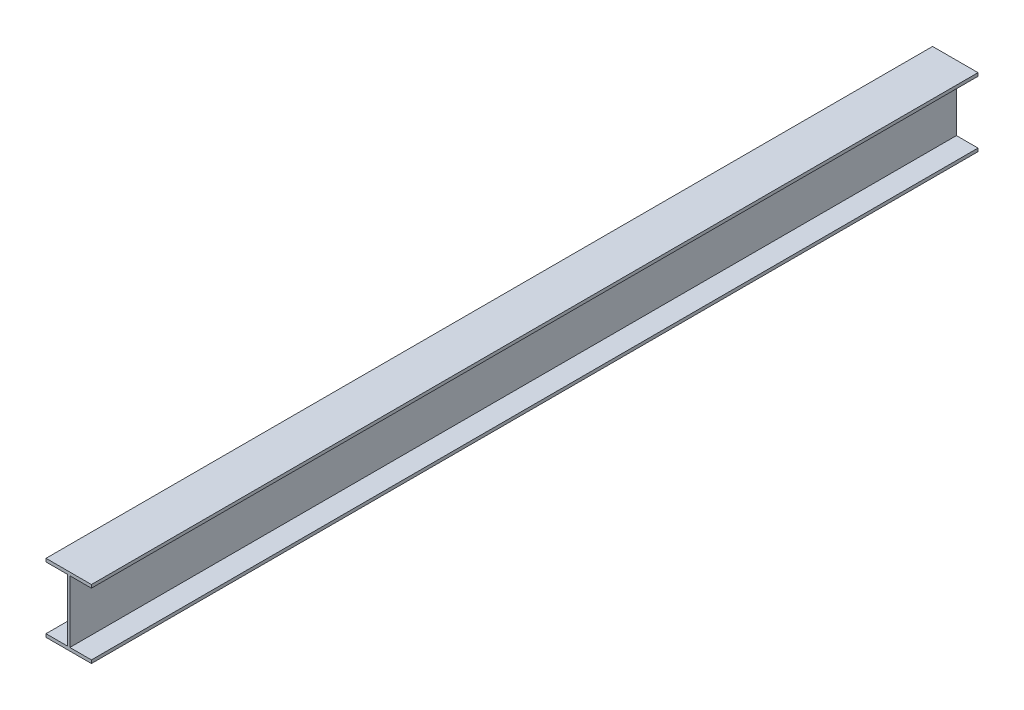
ISO-10303-21;
HEADER;
FILE_DESCRIPTION(('STEP AP214'),'2;1');
FILE_NAME('part.step','',(''),(''),'','','');
FILE_SCHEMA(('AUTOMOTIVE_DESIGN { 1 0 10303 214 1 1 1 1 }'));
ENDSEC;
DATA;
#1=APPLICATION_CONTEXT('core data for automotive mechanical design processes');
#2=APPLICATION_PROTOCOL_DEFINITION('international standard','automotive_design',2000,#1);
#3=PRODUCT_CONTEXT('',#1,'mechanical');
#4=PRODUCT('Part','Part','',(#3));
#5=PRODUCT_RELATED_PRODUCT_CATEGORY('part','',(#4));
#6=PRODUCT_DEFINITION_FORMATION('','',#4);
#7=PRODUCT_DEFINITION_CONTEXT('part definition',#1,'design');
#8=PRODUCT_DEFINITION('design','',#6,#7);
#9=PRODUCT_DEFINITION_SHAPE('','',#8);
#10=(LENGTH_UNIT() NAMED_UNIT(*) SI_UNIT(.MILLI.,.METRE.));
#11=(NAMED_UNIT(*) PLANE_ANGLE_UNIT() SI_UNIT($,.RADIAN.));
#12=(NAMED_UNIT(*) SI_UNIT($,.STERADIAN.) SOLID_ANGLE_UNIT());
#13=UNCERTAINTY_MEASURE_WITH_UNIT(LENGTH_MEASURE(1.E-05),#10,'distance_accuracy_value','');
#14=(GEOMETRIC_REPRESENTATION_CONTEXT(3) GLOBAL_UNCERTAINTY_ASSIGNED_CONTEXT((#13)) GLOBAL_UNIT_ASSIGNED_CONTEXT((#10,
#11,#12)) REPRESENTATION_CONTEXT('',''));
#15=CARTESIAN_POINT('',(0.,0.,0.));
#16=DIRECTION('',(0.,0.,1.));
#17=DIRECTION('',(1.,0.,0.));
#18=AXIS2_PLACEMENT_3D('',#15,#16,#17);
#19=CARTESIAN_POINT('',(101.6,-153.162240532958,1800.));
#20=DIRECTION('',(0.,1.,0.));
#21=DIRECTION('',(0.,0.,1.));
#22=AXIS2_PLACEMENT_3D('',#19,#20,#21);
#23=PLANE('',#22);
#24=DIRECTION('',(-1.,0.,0.));
#25=VECTOR('',#24,1.);
#26=CARTESIAN_POINT('',(101.6,-153.162240532958,1050.));
#27=LINE('',#26,#25);
#28=CARTESIAN_POINT('',(101.6,-153.162240532958,1050.));
#29=VERTEX_POINT('',#28);
#30=CARTESIAN_POINT('',(0.,-153.162240532958,1050.));
#31=VERTEX_POINT('',#30);
#32=EDGE_CURVE('E11',#29,#31,#27,.T.);
#33=ORIENTED_EDGE('',*,*,#32,.F.);
#34=DIRECTION('',(0.,0.,-1.));
#35=VECTOR('',#34,1.);
#36=CARTESIAN_POINT('',(101.6,-153.162240532958,1800.));
#37=LINE('',#36,#35);
#38=CARTESIAN_POINT('',(101.6,-153.162240532958,1800.));
#39=VERTEX_POINT('',#38);
#40=EDGE_CURVE('E232',#39,#29,#37,.T.);
#41=ORIENTED_EDGE('',*,*,#40,.F.);
#42=DIRECTION('',(1.,0.,0.));
#43=VECTOR('',#42,1.);
#44=CARTESIAN_POINT('',(101.6,-153.162240532958,1800.));
#45=LINE('',#44,#43);
#46=CARTESIAN_POINT('',(0.,-153.162240532958,1800.));
#47=VERTEX_POINT('',#46);
#48=EDGE_CURVE('E206',#47,#39,#45,.T.);
#49=ORIENTED_EDGE('',*,*,#48,.F.);
#50=DIRECTION('',(0.,0.,-1.));
#51=VECTOR('',#50,1.);
#52=CARTESIAN_POINT('',(0.,-153.162240532958,1800.));
#53=LINE('',#52,#51);
#54=EDGE_CURVE('E237',#47,#31,#53,.T.);
#55=ORIENTED_EDGE('',*,*,#54,.T.);
#56=EDGE_LOOP('',(#33,#41,#49,#55));
#57=FACE_BOUND('',#56,.T.);
#58=ADVANCED_FACE('F37',(#57),#23,.F.);
#59=DIRECTION('',(1.,0.,0.));
#60=VECTOR('',#59,1.);
#61=CARTESIAN_POINT('',(101.6,-153.162240532958,750.));
#62=LINE('',#61,#60);
#63=CARTESIAN_POINT('',(0.,-153.162240532958,750.));
#64=VERTEX_POINT('',#63);
#65=CARTESIAN_POINT('',(101.6,-153.162240532958,750.));
#66=VERTEX_POINT('',#65);
#67=EDGE_CURVE('E46',#64,#66,#62,.T.);
#68=ORIENTED_EDGE('',*,*,#67,.F.);
#69=CARTESIAN_POINT('',(0.,-153.162240532958,-183.1));
#70=VERTEX_POINT('',#69);
#71=EDGE_CURVE('E235',#64,#70,#53,.T.);
#72=ORIENTED_EDGE('',*,*,#71,.T.);
#73=DIRECTION('',(-1.,0.,0.));
#74=VECTOR('',#73,1.);
#75=CARTESIAN_POINT('',(101.6,-153.162240532958,-183.1));
#76=LINE('',#75,#74);
#77=CARTESIAN_POINT('',(101.6,-153.162240532958,-183.1));
#78=VERTEX_POINT('',#77);
#79=EDGE_CURVE('E188',#78,#70,#76,.T.);
#80=ORIENTED_EDGE('',*,*,#79,.F.);
#81=EDGE_CURVE('E231',#66,#78,#37,.T.);
#82=ORIENTED_EDGE('',*,*,#81,.F.);
#83=EDGE_LOOP('',(#68,#72,#80,#82));
#84=FACE_BOUND('',#83,.T.);
#85=ADVANCED_FACE('F255',(#84),#23,.F.);
#86=CARTESIAN_POINT('',(0.,-7.11224053295814,1800.));
#87=DIRECTION('',(1.,0.,0.));
#88=DIRECTION('',(0.,0.,-1.));
#89=AXIS2_PLACEMENT_3D('',#86,#87,#88);
#90=PLANE('',#89);
#91=DIRECTION('',(0.,0.,-1.));
#92=VECTOR('',#91,1.);
#93=CARTESIAN_POINT('',(0.,-0.000240532958142959,1800.));
#94=LINE('',#93,#92);
#95=CARTESIAN_POINT('',(0.,-0.000240532958142959,1800.));
#96=VERTEX_POINT('',#95);
#97=CARTESIAN_POINT('',(0.,-0.000240532958142959,-183.1));
#98=VERTEX_POINT('',#97);
#99=EDGE_CURVE('E159',#96,#98,#94,.T.);
#100=ORIENTED_EDGE('',*,*,#99,.T.);
#101=DIRECTION('',(0.,1.,0.));
#102=VECTOR('',#101,1.);
#103=CARTESIAN_POINT('',(0.,-7.11224053295814,-183.1));
#104=LINE('',#103,#102);
#105=CARTESIAN_POINT('',(0.,-7.11224053295814,-183.1));
#106=VERTEX_POINT('',#105);
#107=EDGE_CURVE('E157',#106,#98,#104,.T.);
#108=ORIENTED_EDGE('',*,*,#107,.F.);
#109=DIRECTION('',(0.,0.,-1.));
#110=VECTOR('',#109,1.);
#111=CARTESIAN_POINT('',(0.,-7.11224053295814,1800.));
#112=LINE('',#111,#110);
#113=CARTESIAN_POINT('',(0.,-7.11224053295814,1800.));
#114=VERTEX_POINT('',#113);
#115=EDGE_CURVE('E144',#114,#106,#112,.T.);
#116=ORIENTED_EDGE('',*,*,#115,.F.);
#117=DIRECTION('',(0.,-1.,0.));
#118=VECTOR('',#117,1.);
#119=CARTESIAN_POINT('',(0.,-7.11224053295814,1800.));
#120=LINE('',#119,#118);
#121=EDGE_CURVE('E197',#96,#114,#120,.T.);
#122=ORIENTED_EDGE('',*,*,#121,.F.);
#123=EDGE_LOOP('',(#100,#108,#116,#122));
#124=FACE_BOUND('',#123,.T.);
#125=ADVANCED_FACE('F39',(#124),#90,.F.);
#126=CARTESIAN_POINT('',(47.5660357142857,-7.11224053295814,1800.));
#127=DIRECTION('',(0.,1.,0.));
#128=DIRECTION('',(-1.,0.,0.));
#129=AXIS2_PLACEMENT_3D('',#126,#127,#128);
#130=PLANE('',#129);
#131=ORIENTED_EDGE('',*,*,#115,.T.);
#132=DIRECTION('',(-1.,0.,0.));
#133=VECTOR('',#132,1.);
#134=CARTESIAN_POINT('',(47.5660357142857,-7.11224053295814,-183.1));
#135=LINE('',#134,#133);
#136=CARTESIAN_POINT('',(47.5660357142857,-7.11224053295814,-183.1));
#137=VERTEX_POINT('',#136);
#138=EDGE_CURVE('E149',#137,#106,#135,.T.);
#139=ORIENTED_EDGE('',*,*,#138,.F.);
#140=DIRECTION('',(0.,0.,-1.));
#141=VECTOR('',#140,1.);
#142=CARTESIAN_POINT('',(47.5660357142857,-7.11224053295814,1800.));
#143=LINE('',#142,#141);
#144=CARTESIAN_POINT('',(47.5660357142857,-7.11224053295814,1800.));
#145=VERTEX_POINT('',#144);
#146=EDGE_CURVE('E154',#145,#137,#143,.T.);
#147=ORIENTED_EDGE('',*,*,#146,.F.);
#148=DIRECTION('',(1.,0.,0.));
#149=VECTOR('',#148,1.);
#150=CARTESIAN_POINT('',(47.5660357142857,-7.11224053295814,1800.));
#151=LINE('',#150,#149);
#152=EDGE_CURVE('E150',#114,#145,#151,.T.);
#153=ORIENTED_EDGE('',*,*,#152,.F.);
#154=EDGE_LOOP('',(#131,#139,#147,#153));
#155=FACE_BOUND('',#154,.T.);
#156=ADVANCED_FACE('F146',(#155),#130,.F.);
#157=CARTESIAN_POINT('',(47.5660357142857,-146.050240532958,1800.));
#158=DIRECTION('',(1.,0.,0.));
#159=DIRECTION('',(0.,0.,-1.));
#160=AXIS2_PLACEMENT_3D('',#157,#158,#159);
#161=PLANE('',#160);
#162=ORIENTED_EDGE('',*,*,#146,.T.);
#163=DIRECTION('',(0.,1.,0.));
#164=VECTOR('',#163,1.);
#165=CARTESIAN_POINT('',(47.5660357142857,-146.050240532958,-183.1));
#166=LINE('',#165,#164);
#167=CARTESIAN_POINT('',(47.5660357142857,-146.050240532958,-183.1));
#168=VERTEX_POINT('',#167);
#169=EDGE_CURVE('E169',#168,#137,#166,.T.);
#170=ORIENTED_EDGE('',*,*,#169,.F.);
#171=DIRECTION('',(0.,0.,-1.));
#172=VECTOR('',#171,1.);
#173=CARTESIAN_POINT('',(47.5660357142857,-146.050240532958,1800.));
#174=LINE('',#173,#172);
#175=CARTESIAN_POINT('',(47.5660357142857,-146.050240532958,1800.));
#176=VERTEX_POINT('',#175);
#177=EDGE_CURVE('E243',#176,#168,#174,.T.);
#178=ORIENTED_EDGE('',*,*,#177,.F.);
#179=DIRECTION('',(0.,-1.,0.));
#180=VECTOR('',#179,1.);
#181=CARTESIAN_POINT('',(47.5660357142857,-146.050240532958,1800.));
#182=LINE('',#181,#180);
#183=EDGE_CURVE('E200',#145,#176,#182,.T.);
#184=ORIENTED_EDGE('',*,*,#183,.F.);
#185=EDGE_LOOP('',(#162,#170,#178,#184));
#186=FACE_BOUND('',#185,.T.);
#187=ADVANCED_FACE('F278',(#186),#161,.F.);
#188=CARTESIAN_POINT('',(0.,-146.050240532958,1800.));
#189=DIRECTION('',(0.,-1.,0.));
#190=DIRECTION('',(1.,0.,0.));
#191=AXIS2_PLACEMENT_3D('',#188,#189,#190);
#192=PLANE('',#191);
#193=ORIENTED_EDGE('',*,*,#177,.T.);
#194=DIRECTION('',(1.,0.,0.));
#195=VECTOR('',#194,1.);
#196=CARTESIAN_POINT('',(0.,-146.050240532958,-183.1));
#197=LINE('',#196,#195);
#198=CARTESIAN_POINT('',(0.,-146.050240532958,-183.1));
#199=VERTEX_POINT('',#198);
#200=EDGE_CURVE('E194',#199,#168,#197,.T.);
#201=ORIENTED_EDGE('',*,*,#200,.F.);
#202=DIRECTION('',(0.,0.,-1.));
#203=VECTOR('',#202,1.);
#204=CARTESIAN_POINT('',(0.,-146.050240532958,1800.));
#205=LINE('',#204,#203);
#206=CARTESIAN_POINT('',(0.,-146.050240532958,1800.));
#207=VERTEX_POINT('',#206);
#208=EDGE_CURVE('E240',#207,#199,#205,.T.);
#209=ORIENTED_EDGE('',*,*,#208,.F.);
#210=DIRECTION('',(-1.,0.,0.));
#211=VECTOR('',#210,1.);
#212=CARTESIAN_POINT('',(0.,-146.050240532958,1800.));
#213=LINE('',#212,#211);
#214=EDGE_CURVE('E202',#176,#207,#213,.T.);
#215=ORIENTED_EDGE('',*,*,#214,.F.);
#216=EDGE_LOOP('',(#193,#201,#209,#215));
#217=FACE_BOUND('',#216,.T.);
#218=ADVANCED_FACE('F274',(#217),#192,.F.);
#219=CARTESIAN_POINT('',(0.,-153.162240532958,1800.));
#220=DIRECTION('',(1.,0.,0.));
#221=DIRECTION('',(0.,0.,-1.));
#222=AXIS2_PLACEMENT_3D('',#219,#220,#221);
#223=PLANE('',#222);
#224=ORIENTED_EDGE('',*,*,#208,.T.);
#225=DIRECTION('',(0.,1.,0.));
#226=VECTOR('',#225,1.);
#227=CARTESIAN_POINT('',(0.,-153.162240532958,-183.1));
#228=LINE('',#227,#226);
#229=EDGE_CURVE('E191',#70,#199,#228,.T.);
#230=ORIENTED_EDGE('',*,*,#229,.F.);
#231=ORIENTED_EDGE('',*,*,#71,.F.);
#232=CARTESIAN_POINT('',(0.,-153.162240532958,900.));
#233=VERTEX_POINT('',#232);
#234=EDGE_CURVE('E59',#233,#64,#53,.T.);
#235=ORIENTED_EDGE('',*,*,#234,.F.);
#236=EDGE_CURVE('E241',#31,#233,#53,.T.);
#237=ORIENTED_EDGE('',*,*,#236,.F.);
#238=ORIENTED_EDGE('',*,*,#54,.F.);
#239=DIRECTION('',(0.,-1.,0.));
#240=VECTOR('',#239,1.);
#241=CARTESIAN_POINT('',(0.,-153.162240532958,1800.));
#242=LINE('',#241,#240);
#243=EDGE_CURVE('E204',#207,#47,#242,.T.);
#244=ORIENTED_EDGE('',*,*,#243,.F.);
#245=EDGE_LOOP('',(#224,#230,#231,#235,#237,#238,#244));
#246=FACE_BOUND('',#245,.T.);
#247=ADVANCED_FACE('F263',(#246),#223,.F.);
#248=CARTESIAN_POINT('',(101.6,-153.162240532958,900.));
#249=VERTEX_POINT('',#248);
#250=EDGE_CURVE('E236',#29,#249,#37,.T.);
#251=ORIENTED_EDGE('',*,*,#250,.F.);
#252=ORIENTED_EDGE('',*,*,#32,.T.);
#253=ORIENTED_EDGE('',*,*,#236,.T.);
#254=ORIENTED_EDGE('',*,*,#234,.T.);
#255=ORIENTED_EDGE('',*,*,#67,.T.);
#256=EDGE_CURVE('E252',#249,#66,#37,.T.);
#257=ORIENTED_EDGE('',*,*,#256,.F.);
#258=EDGE_LOOP('',(#251,#252,#253,#254,#255,#257));
#259=FACE_BOUND('',#258,.T.);
#260=ADVANCED_FACE('F250',(#259),#23,.F.);
#261=CARTESIAN_POINT('',(101.6,-146.050240532958,1800.));
#262=DIRECTION('',(-1.,0.,0.));
#263=DIRECTION('',(0.,0.,1.));
#264=AXIS2_PLACEMENT_3D('',#261,#262,#263);
#265=PLANE('',#264);
#266=ORIENTED_EDGE('',*,*,#81,.T.);
#267=DIRECTION('',(0.,-1.,0.));
#268=VECTOR('',#267,1.);
#269=CARTESIAN_POINT('',(101.6,-146.050240532958,-183.1));
#270=LINE('',#269,#268);
#271=CARTESIAN_POINT('',(101.6,-146.050240532958,-183.1));
#272=VERTEX_POINT('',#271);
#273=EDGE_CURVE('E185',#272,#78,#270,.T.);
#274=ORIENTED_EDGE('',*,*,#273,.F.);
#275=DIRECTION('',(0.,0.,-1.));
#276=VECTOR('',#275,1.);
#277=CARTESIAN_POINT('',(101.6,-146.050240532958,1800.));
#278=LINE('',#277,#276);
#279=CARTESIAN_POINT('',(101.6,-146.050240532958,1800.));
#280=VERTEX_POINT('',#279);
#281=EDGE_CURVE('E229',#280,#272,#278,.T.);
#282=ORIENTED_EDGE('',*,*,#281,.F.);
#283=DIRECTION('',(0.,1.,0.));
#284=VECTOR('',#283,1.);
#285=CARTESIAN_POINT('',(101.6,-146.050240532958,1800.));
#286=LINE('',#285,#284);
#287=EDGE_CURVE('E208',#39,#280,#286,.T.);
#288=ORIENTED_EDGE('',*,*,#287,.F.);
#289=ORIENTED_EDGE('',*,*,#40,.T.);
#290=ORIENTED_EDGE('',*,*,#250,.T.);
#291=ORIENTED_EDGE('',*,*,#256,.T.);
#292=EDGE_LOOP('',(#266,#274,#282,#288,#289,#290,#291));
#293=FACE_BOUND('',#292,.T.);
#294=ADVANCED_FACE('F258',(#293),#265,.F.);
#295=CARTESIAN_POINT('',(53.4080357142857,-146.050240532958,1800.));
#296=DIRECTION('',(0.,-1.,0.));
#297=DIRECTION('',(1.,0.,0.));
#298=AXIS2_PLACEMENT_3D('',#295,#296,#297);
#299=PLANE('',#298);
#300=ORIENTED_EDGE('',*,*,#281,.T.);
#301=DIRECTION('',(1.,0.,0.));
#302=VECTOR('',#301,1.);
#303=CARTESIAN_POINT('',(53.4080357142857,-146.050240532958,-183.1));
#304=LINE('',#303,#302);
#305=CARTESIAN_POINT('',(53.4080357142857,-146.050240532958,-183.1));
#306=VERTEX_POINT('',#305);
#307=EDGE_CURVE('E182',#306,#272,#304,.T.);
#308=ORIENTED_EDGE('',*,*,#307,.F.);
#309=DIRECTION('',(0.,0.,-1.));
#310=VECTOR('',#309,1.);
#311=CARTESIAN_POINT('',(53.4080357142857,-146.050240532958,1800.));
#312=LINE('',#311,#310);
#313=CARTESIAN_POINT('',(53.4080357142857,-146.050240532958,1800.));
#314=VERTEX_POINT('',#313);
#315=EDGE_CURVE('E227',#314,#306,#312,.T.);
#316=ORIENTED_EDGE('',*,*,#315,.F.);
#317=DIRECTION('',(-1.,0.,0.));
#318=VECTOR('',#317,1.);
#319=CARTESIAN_POINT('',(53.4080357142857,-146.050240532958,1800.));
#320=LINE('',#319,#318);
#321=EDGE_CURVE('E210',#280,#314,#320,.T.);
#322=ORIENTED_EDGE('',*,*,#321,.F.);
#323=EDGE_LOOP('',(#300,#308,#316,#322));
#324=FACE_BOUND('',#323,.T.);
#325=ADVANCED_FACE('F301',(#324),#299,.F.);
#326=CARTESIAN_POINT('',(53.4080357142857,-7.11224053295815,1800.));
#327=DIRECTION('',(-1.,0.,0.));
#328=DIRECTION('',(0.,-1.,0.));
#329=AXIS2_PLACEMENT_3D('',#326,#327,#328);
#330=PLANE('',#329);
#331=ORIENTED_EDGE('',*,*,#315,.T.);
#332=DIRECTION('',(0.,-1.,0.));
#333=VECTOR('',#332,1.);
#334=CARTESIAN_POINT('',(53.4080357142857,-7.11224053295815,-183.1));
#335=LINE('',#334,#333);
#336=CARTESIAN_POINT('',(53.4080357142857,-7.11224053295815,-183.1));
#337=VERTEX_POINT('',#336);
#338=EDGE_CURVE('E179',#337,#306,#335,.T.);
#339=ORIENTED_EDGE('',*,*,#338,.F.);
#340=DIRECTION('',(0.,0.,-1.));
#341=VECTOR('',#340,1.);
#342=CARTESIAN_POINT('',(53.4080357142857,-7.11224053295815,1800.));
#343=LINE('',#342,#341);
#344=CARTESIAN_POINT('',(53.4080357142857,-7.11224053295815,1800.));
#345=VERTEX_POINT('',#344);
#346=EDGE_CURVE('E225',#345,#337,#343,.T.);
#347=ORIENTED_EDGE('',*,*,#346,.F.);
#348=DIRECTION('',(0.,1.,0.));
#349=VECTOR('',#348,1.);
#350=CARTESIAN_POINT('',(53.4080357142857,-7.11224053295815,1800.));
#351=LINE('',#350,#349);
#352=EDGE_CURVE('E212',#314,#345,#351,.T.);
#353=ORIENTED_EDGE('',*,*,#352,.F.);
#354=EDGE_LOOP('',(#331,#339,#347,#353));
#355=FACE_BOUND('',#354,.T.);
#356=ADVANCED_FACE('F296',(#355),#330,.F.);
#357=CARTESIAN_POINT('',(101.6,-7.11224053295814,1800.));
#358=DIRECTION('',(0.,1.,0.));
#359=DIRECTION('',(-1.,0.,0.));
#360=AXIS2_PLACEMENT_3D('',#357,#358,#359);
#361=PLANE('',#360);
#362=ORIENTED_EDGE('',*,*,#346,.T.);
#363=DIRECTION('',(-1.,0.,0.));
#364=VECTOR('',#363,1.);
#365=CARTESIAN_POINT('',(101.6,-7.11224053295814,-183.1));
#366=LINE('',#365,#364);
#367=CARTESIAN_POINT('',(101.6,-7.11224053295814,-183.1));
#368=VERTEX_POINT('',#367);
#369=EDGE_CURVE('E176',#368,#337,#366,.T.);
#370=ORIENTED_EDGE('',*,*,#369,.F.);
#371=DIRECTION('',(0.,0.,-1.));
#372=VECTOR('',#371,1.);
#373=CARTESIAN_POINT('',(101.6,-7.11224053295814,1800.));
#374=LINE('',#373,#372);
#375=CARTESIAN_POINT('',(101.6,-7.11224053295814,1800.));
#376=VERTEX_POINT('',#375);
#377=EDGE_CURVE('E223',#376,#368,#374,.T.);
#378=ORIENTED_EDGE('',*,*,#377,.F.);
#379=DIRECTION('',(1.,0.,0.));
#380=VECTOR('',#379,1.);
#381=CARTESIAN_POINT('',(101.6,-7.11224053295814,1800.));
#382=LINE('',#381,#380);
#383=EDGE_CURVE('E214',#345,#376,#382,.T.);
#384=ORIENTED_EDGE('',*,*,#383,.F.);
#385=EDGE_LOOP('',(#362,#370,#378,#384));
#386=FACE_BOUND('',#385,.T.);
#387=ADVANCED_FACE('F291',(#386),#361,.F.);
#388=CARTESIAN_POINT('',(101.6,-0.000240532958130516,1800.));
#389=DIRECTION('',(-1.,0.,0.));
#390=DIRECTION('',(0.,0.,1.));
#391=AXIS2_PLACEMENT_3D('',#388,#389,#390);
#392=PLANE('',#391);
#393=ORIENTED_EDGE('',*,*,#377,.T.);
#394=DIRECTION('',(0.,-1.,0.));
#395=VECTOR('',#394,1.);
#396=CARTESIAN_POINT('',(101.6,-0.000240532958130516,-183.1));
#397=LINE('',#396,#395);
#398=CARTESIAN_POINT('',(101.6,-0.000240532958130516,-183.1));
#399=VERTEX_POINT('',#398);
#400=EDGE_CURVE('E173',#399,#368,#397,.T.);
#401=ORIENTED_EDGE('',*,*,#400,.F.);
#402=DIRECTION('',(0.,0.,-1.));
#403=VECTOR('',#402,1.);
#404=CARTESIAN_POINT('',(101.6,-0.000240532958130516,1800.));
#405=LINE('',#404,#403);
#406=CARTESIAN_POINT('',(101.6,-0.000240532958130516,1800.));
#407=VERTEX_POINT('',#406);
#408=EDGE_CURVE('E221',#407,#399,#405,.T.);
#409=ORIENTED_EDGE('',*,*,#408,.F.);
#410=DIRECTION('',(0.,1.,0.));
#411=VECTOR('',#410,1.);
#412=CARTESIAN_POINT('',(101.6,-0.000240532958130516,1800.));
#413=LINE('',#412,#411);
#414=EDGE_CURVE('E216',#376,#407,#413,.T.);
#415=ORIENTED_EDGE('',*,*,#414,.F.);
#416=EDGE_LOOP('',(#393,#401,#409,#415));
#417=FACE_BOUND('',#416,.T.);
#418=ADVANCED_FACE('F287',(#417),#392,.F.);
#419=CARTESIAN_POINT('',(0.,-0.000240532958142959,1800.));
#420=DIRECTION('',(0.,-1.,0.));
#421=DIRECTION('',(1.,0.,0.));
#422=AXIS2_PLACEMENT_3D('',#419,#420,#421);
#423=PLANE('',#422);
#424=ORIENTED_EDGE('',*,*,#408,.T.);
#425=DIRECTION('',(1.,0.,0.));
#426=VECTOR('',#425,1.);
#427=CARTESIAN_POINT('',(0.,-0.000240532958142959,-183.1));
#428=LINE('',#427,#426);
#429=EDGE_CURVE('E163',#98,#399,#428,.T.);
#430=ORIENTED_EDGE('',*,*,#429,.F.);
#431=ORIENTED_EDGE('',*,*,#99,.F.);
#432=DIRECTION('',(-1.,0.,0.));
#433=VECTOR('',#432,1.);
#434=CARTESIAN_POINT('',(0.,-0.000240532958142959,1800.));
#435=LINE('',#434,#433);
#436=EDGE_CURVE('E218',#407,#96,#435,.T.);
#437=ORIENTED_EDGE('',*,*,#436,.F.);
#438=EDGE_LOOP('',(#424,#430,#431,#437));
#439=FACE_BOUND('',#438,.T.);
#440=ADVANCED_FACE('F283',(#439),#423,.F.);
#441=CARTESIAN_POINT('',(0.,0.,1800.));
#442=DIRECTION('',(0.,0.,-1.));
#443=DIRECTION('',(-1.,0.,0.));
#444=AXIS2_PLACEMENT_3D('',#441,#442,#443);
#445=PLANE('',#444);
#446=ORIENTED_EDGE('',*,*,#121,.T.);
#447=ORIENTED_EDGE('',*,*,#152,.T.);
#448=ORIENTED_EDGE('',*,*,#183,.T.);
#449=ORIENTED_EDGE('',*,*,#214,.T.);
#450=ORIENTED_EDGE('',*,*,#243,.T.);
#451=ORIENTED_EDGE('',*,*,#48,.T.);
#452=ORIENTED_EDGE('',*,*,#287,.T.);
#453=ORIENTED_EDGE('',*,*,#321,.T.);
#454=ORIENTED_EDGE('',*,*,#352,.T.);
#455=ORIENTED_EDGE('',*,*,#383,.T.);
#456=ORIENTED_EDGE('',*,*,#414,.T.);
#457=ORIENTED_EDGE('',*,*,#436,.T.);
#458=EDGE_LOOP('',(#446,#447,#448,#449,#450,#451,#452,#453,#454,#455,#456,#457));
#459=FACE_BOUND('',#458,.T.);
#460=ADVANCED_FACE('F267',(#459),#445,.F.);
#461=CARTESIAN_POINT('',(0.,0.,-183.1));
#462=DIRECTION('',(0.,0.,-1.));
#463=DIRECTION('',(-1.,0.,0.));
#464=AXIS2_PLACEMENT_3D('',#461,#462,#463);
#465=PLANE('',#464);
#466=ORIENTED_EDGE('',*,*,#138,.T.);
#467=ORIENTED_EDGE('',*,*,#107,.T.);
#468=ORIENTED_EDGE('',*,*,#429,.T.);
#469=ORIENTED_EDGE('',*,*,#400,.T.);
#470=ORIENTED_EDGE('',*,*,#369,.T.);
#471=ORIENTED_EDGE('',*,*,#338,.T.);
#472=ORIENTED_EDGE('',*,*,#307,.T.);
#473=ORIENTED_EDGE('',*,*,#273,.T.);
#474=ORIENTED_EDGE('',*,*,#79,.T.);
#475=ORIENTED_EDGE('',*,*,#229,.T.);
#476=ORIENTED_EDGE('',*,*,#200,.T.);
#477=ORIENTED_EDGE('',*,*,#169,.T.);
#478=EDGE_LOOP('',(#466,#467,#468,#469,#470,#471,#472,#473,#474,#475,#476,#477));
#479=FACE_BOUND('',#478,.T.);
#480=ADVANCED_FACE('F166',(#479),#465,.T.);
#481=CLOSED_SHELL('',(#58,#85,#125,#156,#187,#218,#247,#260,#294,#325,#356,#387,#418,#440,#460,#480));
#482=MANIFOLD_SOLID_BREP('B2',#481);
#483=ADVANCED_BREP_SHAPE_REPRESENTATION('',(#18,#482),#14);
#484=SHAPE_DEFINITION_REPRESENTATION(#9,#483);
ENDSEC;
END-ISO-10303-21;
